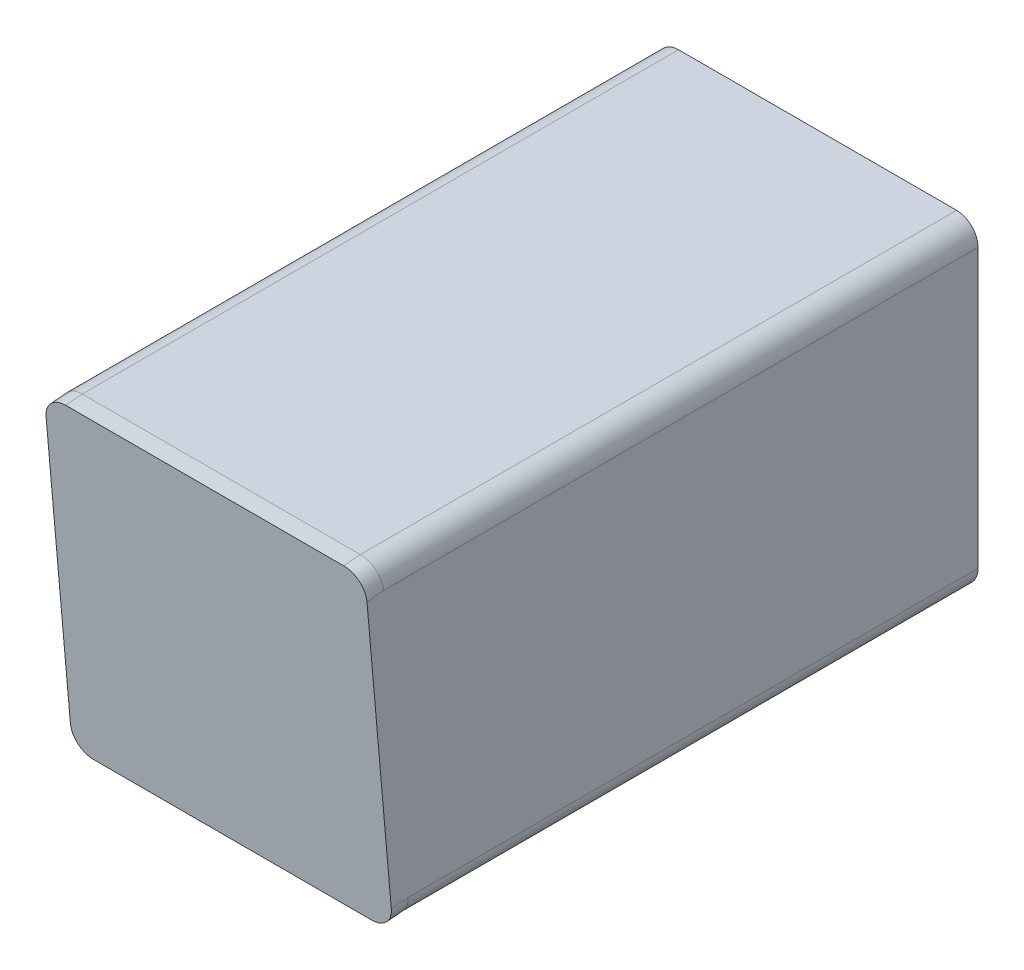
ISO-10303-21;
HEADER;
FILE_DESCRIPTION(('STEP AP214'),'2;1');
FILE_NAME('part.step','',(''),(''),'','','');
FILE_SCHEMA(('AUTOMOTIVE_DESIGN { 1 0 10303 214 1 1 1 1 }'));
ENDSEC;
DATA;
#1=APPLICATION_CONTEXT('core data for automotive mechanical design processes');
#2=APPLICATION_PROTOCOL_DEFINITION('international standard','automotive_design',2000,#1);
#3=PRODUCT_CONTEXT('',#1,'mechanical');
#4=PRODUCT('Part','Part','',(#3));
#5=PRODUCT_RELATED_PRODUCT_CATEGORY('part','',(#4));
#6=PRODUCT_DEFINITION_FORMATION('','',#4);
#7=PRODUCT_DEFINITION_CONTEXT('part definition',#1,'design');
#8=PRODUCT_DEFINITION('design','',#6,#7);
#9=PRODUCT_DEFINITION_SHAPE('','',#8);
#10=(LENGTH_UNIT() NAMED_UNIT(*) SI_UNIT(.MILLI.,.METRE.));
#11=(NAMED_UNIT(*) PLANE_ANGLE_UNIT() SI_UNIT($,.RADIAN.));
#12=(NAMED_UNIT(*) SI_UNIT($,.STERADIAN.) SOLID_ANGLE_UNIT());
#13=UNCERTAINTY_MEASURE_WITH_UNIT(LENGTH_MEASURE(1.E-05),#10,'distance_accuracy_value','');
#14=(GEOMETRIC_REPRESENTATION_CONTEXT(3) GLOBAL_UNCERTAINTY_ASSIGNED_CONTEXT((#13)) GLOBAL_UNIT_ASSIGNED_CONTEXT((#10,
#11,#12)) REPRESENTATION_CONTEXT('',''));
#15=CARTESIAN_POINT('',(0.,0.,0.));
#16=DIRECTION('',(0.,0.,1.));
#17=DIRECTION('',(1.,0.,0.));
#18=AXIS2_PLACEMENT_3D('',#15,#16,#17);
#19=CARTESIAN_POINT('',(2.54,-35.56,0.));
#20=DIRECTION('',(0.,0.,1.));
#21=DIRECTION('',(1.,0.,0.));
#22=AXIS2_PLACEMENT_3D('',#19,#20,#21);
#23=PLANE('',#22);
#24=CARTESIAN_POINT('',(2.54,-35.56,0.));
#25=DIRECTION('',(0.,0.,1.));
#26=DIRECTION('',(1.,0.,0.));
#27=AXIS2_PLACEMENT_3D('',#24,#25,#26);
#28=CIRCLE('',#27,2.54);
#29=CARTESIAN_POINT('',(0.,-35.56,0.));
#30=VERTEX_POINT('',#29);
#31=CARTESIAN_POINT('',(2.54000000000002,-38.1,0.));
#32=VERTEX_POINT('',#31);
#33=EDGE_CURVE('E363',#30,#32,#28,.T.);
#34=ORIENTED_EDGE('',*,*,#33,.F.);
#35=DIRECTION('',(0.,-1.,0.));
#36=VECTOR('',#35,1.);
#37=CARTESIAN_POINT('',(0.,-2.54000000000002,0.));
#38=LINE('',#37,#36);
#39=CARTESIAN_POINT('',(0.,-2.54000000000002,0.));
#40=VERTEX_POINT('',#39);
#41=EDGE_CURVE('E347',#40,#30,#38,.T.);
#42=ORIENTED_EDGE('',*,*,#41,.F.);
#43=CARTESIAN_POINT('',(2.54,-2.54,0.));
#44=DIRECTION('',(0.,0.,1.));
#45=DIRECTION('',(-1.,0.,0.));
#46=AXIS2_PLACEMENT_3D('',#43,#44,#45);
#47=CIRCLE('',#46,2.54);
#48=CARTESIAN_POINT('',(2.54000000000002,0.,0.));
#49=VERTEX_POINT('',#48);
#50=EDGE_CURVE('E350',#49,#40,#47,.T.);
#51=ORIENTED_EDGE('',*,*,#50,.F.);
#52=DIRECTION('',(-1.,0.,0.));
#53=VECTOR('',#52,1.);
#54=CARTESIAN_POINT('',(2.54000000000002,0.,0.));
#55=LINE('',#54,#53);
#56=CARTESIAN_POINT('',(35.56,0.,0.));
#57=VERTEX_POINT('',#56);
#58=EDGE_CURVE('E353',#57,#49,#55,.T.);
#59=ORIENTED_EDGE('',*,*,#58,.F.);
#60=CARTESIAN_POINT('',(35.56,-2.54,0.));
#61=DIRECTION('',(0.,0.,1.));
#62=DIRECTION('',(1.,0.,0.));
#63=AXIS2_PLACEMENT_3D('',#60,#61,#62);
#64=CIRCLE('',#63,2.54);
#65=CARTESIAN_POINT('',(38.1,-2.54000000000002,0.));
#66=VERTEX_POINT('',#65);
#67=EDGE_CURVE('E355',#66,#57,#64,.T.);
#68=ORIENTED_EDGE('',*,*,#67,.F.);
#69=DIRECTION('',(0.,1.,0.));
#70=VECTOR('',#69,1.);
#71=CARTESIAN_POINT('',(38.1,-2.54000000000002,0.));
#72=LINE('',#71,#70);
#73=CARTESIAN_POINT('',(38.1,-35.56,0.));
#74=VERTEX_POINT('',#73);
#75=EDGE_CURVE('E357',#74,#66,#72,.T.);
#76=ORIENTED_EDGE('',*,*,#75,.F.);
#77=CARTESIAN_POINT('',(35.56,-35.56,0.));
#78=DIRECTION('',(0.,0.,1.));
#79=DIRECTION('',(-1.,0.,0.));
#80=AXIS2_PLACEMENT_3D('',#77,#78,#79);
#81=CIRCLE('',#80,2.54);
#82=CARTESIAN_POINT('',(35.56,-38.1,0.));
#83=VERTEX_POINT('',#82);
#84=EDGE_CURVE('E360',#83,#74,#81,.T.);
#85=ORIENTED_EDGE('',*,*,#84,.F.);
#86=DIRECTION('',(1.,0.,0.));
#87=VECTOR('',#86,1.);
#88=CARTESIAN_POINT('',(2.54000000000002,-38.1,0.));
#89=LINE('',#88,#87);
#90=EDGE_CURVE('E326',#32,#83,#89,.T.);
#91=ORIENTED_EDGE('',*,*,#90,.F.);
#92=EDGE_LOOP('',(#34,#42,#51,#59,#68,#76,#85,#91));
#93=FACE_BOUND('',#92,.T.);
#94=CARTESIAN_POINT('',(5.3086,-32.7914,0.));
#95=DIRECTION('',(0.,0.,1.));
#96=DIRECTION('',(1.,0.,0.));
#97=AXIS2_PLACEMENT_3D('',#94,#95,#96);
#98=CIRCLE('',#97,2.54);
#99=CARTESIAN_POINT('',(2.7686,-32.7914,0.));
#100=VERTEX_POINT('',#99);
#101=CARTESIAN_POINT('',(5.30860000000002,-35.3314,0.));
#102=VERTEX_POINT('',#101);
#103=EDGE_CURVE('E405',#100,#102,#98,.T.);
#104=ORIENTED_EDGE('',*,*,#103,.T.);
#105=DIRECTION('',(1.,0.,0.));
#106=VECTOR('',#105,1.);
#107=CARTESIAN_POINT('',(5.30860000000002,-35.3314,0.));
#108=LINE('',#107,#106);
#109=CARTESIAN_POINT('',(32.7914,-35.3314,0.));
#110=VERTEX_POINT('',#109);
#111=EDGE_CURVE('E402',#102,#110,#108,.T.);
#112=ORIENTED_EDGE('',*,*,#111,.T.);
#113=CARTESIAN_POINT('',(32.7914,-32.7914,0.));
#114=DIRECTION('',(0.,0.,1.));
#115=DIRECTION('',(1.,0.,0.));
#116=AXIS2_PLACEMENT_3D('',#113,#114,#115);
#117=CIRCLE('',#116,2.54);
#118=CARTESIAN_POINT('',(35.3314,-32.7914,0.));
#119=VERTEX_POINT('',#118);
#120=EDGE_CURVE('E399',#110,#119,#117,.T.);
#121=ORIENTED_EDGE('',*,*,#120,.T.);
#122=DIRECTION('',(0.,1.,0.));
#123=VECTOR('',#122,1.);
#124=CARTESIAN_POINT('',(35.3314,-5.30860000000002,0.));
#125=LINE('',#124,#123);
#126=CARTESIAN_POINT('',(35.3314,-5.30860000000002,0.));
#127=VERTEX_POINT('',#126);
#128=EDGE_CURVE('E396',#119,#127,#125,.T.);
#129=ORIENTED_EDGE('',*,*,#128,.T.);
#130=CARTESIAN_POINT('',(32.7914,-5.3086,0.));
#131=DIRECTION('',(0.,0.,1.));
#132=DIRECTION('',(1.,0.,0.));
#133=AXIS2_PLACEMENT_3D('',#130,#131,#132);
#134=CIRCLE('',#133,2.54);
#135=CARTESIAN_POINT('',(32.7914,-2.7686,0.));
#136=VERTEX_POINT('',#135);
#137=EDGE_CURVE('E393',#127,#136,#134,.T.);
#138=ORIENTED_EDGE('',*,*,#137,.T.);
#139=DIRECTION('',(-1.,0.,0.));
#140=VECTOR('',#139,1.);
#141=CARTESIAN_POINT('',(5.30860000000002,-2.7686,0.));
#142=LINE('',#141,#140);
#143=CARTESIAN_POINT('',(5.30860000000002,-2.7686,0.));
#144=VERTEX_POINT('',#143);
#145=EDGE_CURVE('E390',#136,#144,#142,.T.);
#146=ORIENTED_EDGE('',*,*,#145,.T.);
#147=CARTESIAN_POINT('',(5.3086,-5.3086,0.));
#148=DIRECTION('',(0.,0.,1.));
#149=DIRECTION('',(1.,0.,0.));
#150=AXIS2_PLACEMENT_3D('',#147,#148,#149);
#151=CIRCLE('',#150,2.54);
#152=CARTESIAN_POINT('',(2.7686,-5.30860000000002,0.));
#153=VERTEX_POINT('',#152);
#154=EDGE_CURVE('E387',#144,#153,#151,.T.);
#155=ORIENTED_EDGE('',*,*,#154,.T.);
#156=DIRECTION('',(0.,-1.,0.));
#157=VECTOR('',#156,1.);
#158=CARTESIAN_POINT('',(2.7686,-5.30860000000002,0.));
#159=LINE('',#158,#157);
#160=EDGE_CURVE('E384',#153,#100,#159,.T.);
#161=ORIENTED_EDGE('',*,*,#160,.T.);
#162=EDGE_LOOP('',(#104,#112,#121,#129,#138,#146,#155,#161));
#163=FACE_BOUND('',#162,.T.);
#164=ADVANCED_FACE('F38',(#93,#163),#23,.F.);
#165=CARTESIAN_POINT('',(2.54,-35.56,70.8));
#166=DIRECTION('',(0.,0.,-1.));
#167=DIRECTION('',(-1.,0.,0.));
#168=AXIS2_PLACEMENT_3D('',#165,#166,#167);
#169=CYLINDRICAL_SURFACE('',#168,2.54);
#170=DIRECTION('',(0.,0.,-1.));
#171=VECTOR('',#170,1.);
#172=CARTESIAN_POINT('',(2.54000000000002,-38.1,70.8));
#173=LINE('',#172,#171);
#174=CARTESIAN_POINT('',(2.54000000000002,-38.1,67.4666819196626));
#175=VERTEX_POINT('',#174);
#176=EDGE_CURVE('E46',#175,#32,#173,.T.);
#177=ORIENTED_EDGE('',*,*,#176,.F.);
#178=CARTESIAN_POINT('',(2.54,-35.56,67.6889031250184));
#179=DIRECTION('',(0.,0.0871557427476515,-0.996194698091746));
#180=DIRECTION('',(0.,-0.996194698091746,-0.0871557427476515));
#181=AXIS2_PLACEMENT_3D('',#178,#179,#180);
#182=ELLIPSE('',#181,2.5497023873601,2.54);
#183=CARTESIAN_POINT('',(0.,-35.56,67.6889031250184));
#184=VERTEX_POINT('',#183);
#185=EDGE_CURVE('E408',#175,#184,#182,.T.);
#186=ORIENTED_EDGE('',*,*,#185,.T.);
#187=DIRECTION('',(0.,0.,-1.));
#188=VECTOR('',#187,1.);
#189=CARTESIAN_POINT('',(0.,-35.56,70.8));
#190=LINE('',#189,#188);
#191=EDGE_CURVE('E344',#184,#30,#190,.T.);
#192=ORIENTED_EDGE('',*,*,#191,.T.);
#193=ORIENTED_EDGE('',*,*,#33,.T.);
#194=EDGE_LOOP('',(#177,#186,#192,#193));
#195=FACE_BOUND('',#194,.T.);
#196=ADVANCED_FACE('F40',(#195),#169,.T.);
#197=CARTESIAN_POINT('',(2.54000000000002,-38.1,70.8));
#198=DIRECTION('',(0.,1.,0.));
#199=DIRECTION('',(0.,0.,1.));
#200=AXIS2_PLACEMENT_3D('',#197,#198,#199);
#201=PLANE('',#200);
#202=DIRECTION('',(0.,0.,-1.));
#203=VECTOR('',#202,1.);
#204=CARTESIAN_POINT('',(35.56,-38.1,70.8));
#205=LINE('',#204,#203);
#206=CARTESIAN_POINT('',(35.56,-38.1,67.4666819196626));
#207=VERTEX_POINT('',#206);
#208=EDGE_CURVE('E323',#207,#83,#205,.T.);
#209=ORIENTED_EDGE('',*,*,#208,.F.);
#210=DIRECTION('',(1.,0.,0.));
#211=VECTOR('',#210,1.);
#212=CARTESIAN_POINT('',(0.,-38.1,67.4666819196625));
#213=LINE('',#212,#211);
#214=EDGE_CURVE('E194',#175,#207,#213,.T.);
#215=ORIENTED_EDGE('',*,*,#214,.F.);
#216=ORIENTED_EDGE('',*,*,#176,.T.);
#217=ORIENTED_EDGE('',*,*,#90,.T.);
#218=EDGE_LOOP('',(#209,#215,#216,#217));
#219=FACE_BOUND('',#218,.T.);
#220=ADVANCED_FACE('F312',(#219),#201,.F.);
#221=CARTESIAN_POINT('',(35.56,-35.56,70.8));
#222=DIRECTION('',(0.,0.,-1.));
#223=DIRECTION('',(-1.,0.,0.));
#224=AXIS2_PLACEMENT_3D('',#221,#222,#223);
#225=CYLINDRICAL_SURFACE('',#224,2.54);
#226=DIRECTION('',(0.,0.,-1.));
#227=VECTOR('',#226,1.);
#228=CARTESIAN_POINT('',(38.1,-35.56,70.8));
#229=LINE('',#228,#227);
#230=CARTESIAN_POINT('',(38.1,-35.56,67.6889031250184));
#231=VERTEX_POINT('',#230);
#232=EDGE_CURVE('E330',#231,#74,#229,.T.);
#233=ORIENTED_EDGE('',*,*,#232,.F.);
#234=CARTESIAN_POINT('',(35.56,-35.56,67.6889031250184));
#235=DIRECTION('',(0.,0.0871557427476515,-0.996194698091746));
#236=DIRECTION('',(0.,-0.996194698091746,-0.0871557427476515));
#237=AXIS2_PLACEMENT_3D('',#234,#235,#236);
#238=ELLIPSE('',#237,2.5497023873601,2.54);
#239=EDGE_CURVE('E411',#231,#207,#238,.T.);
#240=ORIENTED_EDGE('',*,*,#239,.T.);
#241=ORIENTED_EDGE('',*,*,#208,.T.);
#242=ORIENTED_EDGE('',*,*,#84,.T.);
#243=EDGE_LOOP('',(#233,#240,#241,#242));
#244=FACE_BOUND('',#243,.T.);
#245=ADVANCED_FACE('F309',(#244),#225,.T.);
#246=CARTESIAN_POINT('',(38.1,-2.54000000000002,70.8));
#247=DIRECTION('',(-1.,0.,0.));
#248=DIRECTION('',(0.,-1.,0.));
#249=AXIS2_PLACEMENT_3D('',#246,#247,#248);
#250=PLANE('',#249);
#251=DIRECTION('',(0.,0.,-1.));
#252=VECTOR('',#251,1.);
#253=CARTESIAN_POINT('',(38.1,-2.54000000000002,70.8));
#254=LINE('',#253,#252);
#255=CARTESIAN_POINT('',(38.1,-2.54,70.5777787946442));
#256=VERTEX_POINT('',#255);
#257=EDGE_CURVE('E332',#256,#66,#254,.T.);
#258=ORIENTED_EDGE('',*,*,#257,.F.);
#259=DIRECTION('',(0.,0.0871557427476515,-0.996194698091746));
#260=VECTOR('',#259,1.);
#261=CARTESIAN_POINT('',(38.1,-7.41732271243648,126.325832495243));
#262=LINE('',#261,#260);
#263=CARTESIAN_POINT('',(38.1,-2.71225966825905,72.5467158125016));
#264=VERTEX_POINT('',#263);
#265=EDGE_CURVE('E219',#264,#256,#262,.T.);
#266=ORIENTED_EDGE('',*,*,#265,.F.);
#267=DIRECTION('',(0.,0.996194698091746,0.0871557427476584));
#268=VECTOR('',#267,1.);
#269=CARTESIAN_POINT('',(38.1,-35.7322596682594,69.6578401428843));
#270=LINE('',#269,#268);
#271=CARTESIAN_POINT('',(38.1,-35.7322596682598,69.6578401428843));
#272=VERTEX_POINT('',#271);
#273=EDGE_CURVE('E203',#272,#264,#270,.T.);
#274=ORIENTED_EDGE('',*,*,#273,.F.);
#275=DIRECTION('',(0.,0.0871557427476515,-0.996194698091746));
#276=VECTOR('',#275,1.);
#277=CARTESIAN_POINT('',(38.1,-40.4373227124365,123.436956825618));
#278=LINE('',#277,#276);
#279=EDGE_CURVE('E217',#272,#231,#278,.T.);
#280=ORIENTED_EDGE('',*,*,#279,.T.);
#281=ORIENTED_EDGE('',*,*,#232,.T.);
#282=ORIENTED_EDGE('',*,*,#75,.T.);
#283=EDGE_LOOP('',(#258,#266,#274,#280,#281,#282));
#284=FACE_BOUND('',#283,.T.);
#285=ADVANCED_FACE('F305',(#284),#250,.F.);
#286=CARTESIAN_POINT('',(35.56,-2.54,70.8));
#287=DIRECTION('',(0.,0.,-1.));
#288=DIRECTION('',(-1.,0.,0.));
#289=AXIS2_PLACEMENT_3D('',#286,#287,#288);
#290=CYLINDRICAL_SURFACE('',#289,2.54);
#291=DIRECTION('',(0.,0.,-1.));
#292=VECTOR('',#291,1.);
#293=CARTESIAN_POINT('',(35.56,0.,70.8));
#294=LINE('',#293,#292);
#295=CARTESIAN_POINT('',(35.56,0.,70.8));
#296=VERTEX_POINT('',#295);
#297=EDGE_CURVE('E336',#296,#57,#294,.T.);
#298=ORIENTED_EDGE('',*,*,#297,.F.);
#299=CARTESIAN_POINT('',(35.56,-2.54,70.5777787946442));
#300=DIRECTION('',(0.,0.0871557427476515,-0.996194698091746));
#301=DIRECTION('',(0.,-0.996194698091746,-0.0871557427476515));
#302=AXIS2_PLACEMENT_3D('',#299,#300,#301);
#303=ELLIPSE('',#302,2.5497023873601,2.54);
#304=EDGE_CURVE('E413',#296,#256,#303,.T.);
#305=ORIENTED_EDGE('',*,*,#304,.T.);
#306=ORIENTED_EDGE('',*,*,#257,.T.);
#307=ORIENTED_EDGE('',*,*,#67,.T.);
#308=EDGE_LOOP('',(#298,#305,#306,#307));
#309=FACE_BOUND('',#308,.T.);
#310=ADVANCED_FACE('F301',(#309),#290,.T.);
#311=CARTESIAN_POINT('',(2.54000000000002,0.,70.8));
#312=DIRECTION('',(0.,-1.,0.));
#313=DIRECTION('',(0.,0.,-1.));
#314=AXIS2_PLACEMENT_3D('',#311,#312,#313);
#315=PLANE('',#314);
#316=ORIENTED_EDGE('',*,*,#58,.T.);
#317=DIRECTION('',(0.,0.,-1.));
#318=VECTOR('',#317,1.);
#319=CARTESIAN_POINT('',(2.54000000000002,0.,70.8));
#320=LINE('',#319,#318);
#321=CARTESIAN_POINT('',(2.54,0.,70.8));
#322=VERTEX_POINT('',#321);
#323=EDGE_CURVE('E339',#322,#49,#320,.T.);
#324=ORIENTED_EDGE('',*,*,#323,.F.);
#325=DIRECTION('',(-1.,0.,0.));
#326=VECTOR('',#325,1.);
#327=CARTESIAN_POINT('',(2.54000000000002,0.,70.8));
#328=LINE('',#327,#326);
#329=EDGE_CURVE('E346',#296,#322,#328,.T.);
#330=ORIENTED_EDGE('',*,*,#329,.F.);
#331=ORIENTED_EDGE('',*,*,#297,.T.);
#332=EDGE_LOOP('',(#316,#324,#330,#331));
#333=FACE_BOUND('',#332,.T.);
#334=ADVANCED_FACE('F297',(#333),#315,.F.);
#335=CARTESIAN_POINT('',(2.54,-2.54,70.8));
#336=DIRECTION('',(0.,0.,-1.));
#337=DIRECTION('',(-1.,0.,0.));
#338=AXIS2_PLACEMENT_3D('',#335,#336,#337);
#339=CYLINDRICAL_SURFACE('',#338,2.54);
#340=DIRECTION('',(0.,0.,-1.));
#341=VECTOR('',#340,1.);
#342=CARTESIAN_POINT('',(0.,-2.54000000000002,70.8));
#343=LINE('',#342,#341);
#344=CARTESIAN_POINT('',(0.,-2.54000000000002,70.5777787946442));
#345=VERTEX_POINT('',#344);
#346=EDGE_CURVE('E342',#345,#40,#343,.T.);
#347=ORIENTED_EDGE('',*,*,#346,.F.);
#348=CARTESIAN_POINT('',(2.54,-2.54,70.5777787946442));
#349=DIRECTION('',(0.,0.0871557427476515,-0.996194698091746));
#350=DIRECTION('',(0.,-0.996194698091746,-0.0871557427476515));
#351=AXIS2_PLACEMENT_3D('',#348,#349,#350);
#352=ELLIPSE('',#351,2.5497023873601,2.54);
#353=EDGE_CURVE('E53',#345,#322,#352,.T.);
#354=ORIENTED_EDGE('',*,*,#353,.T.);
#355=ORIENTED_EDGE('',*,*,#323,.T.);
#356=ORIENTED_EDGE('',*,*,#50,.T.);
#357=EDGE_LOOP('',(#347,#354,#355,#356));
#358=FACE_BOUND('',#357,.T.);
#359=ADVANCED_FACE('F294',(#358),#339,.T.);
#360=CARTESIAN_POINT('',(0.,-2.54000000000002,70.8));
#361=DIRECTION('',(1.,0.,0.));
#362=DIRECTION('',(0.,1.,0.));
#363=AXIS2_PLACEMENT_3D('',#360,#361,#362);
#364=PLANE('',#363);
#365=ORIENTED_EDGE('',*,*,#191,.F.);
#366=DIRECTION('',(0.,0.0871557427476515,-0.996194698091746));
#367=VECTOR('',#366,1.);
#368=CARTESIAN_POINT('',(0.,-40.4373227124365,123.436956825618));
#369=LINE('',#368,#367);
#370=CARTESIAN_POINT('',(0.,-35.7322596682598,69.6578401428843));
#371=VERTEX_POINT('',#370);
#372=EDGE_CURVE('E184',#371,#184,#369,.T.);
#373=ORIENTED_EDGE('',*,*,#372,.F.);
#374=DIRECTION('',(0.,-0.996194698091746,-0.0871557427476584));
#375=VECTOR('',#374,1.);
#376=CARTESIAN_POINT('',(0.,-2.71225966825946,72.5467158125103));
#377=LINE('',#376,#375);
#378=CARTESIAN_POINT('',(0.,-2.71225966825983,72.5467158125103));
#379=VERTEX_POINT('',#378);
#380=EDGE_CURVE('E178',#379,#371,#377,.T.);
#381=ORIENTED_EDGE('',*,*,#380,.F.);
#382=DIRECTION('',(0.,0.0871557427476515,-0.996194698091746));
#383=VECTOR('',#382,1.);
#384=CARTESIAN_POINT('',(0.,-7.4173227124365,126.325832495243));
#385=LINE('',#384,#383);
#386=EDGE_CURVE('E170',#379,#345,#385,.T.);
#387=ORIENTED_EDGE('',*,*,#386,.T.);
#388=ORIENTED_EDGE('',*,*,#346,.T.);
#389=ORIENTED_EDGE('',*,*,#41,.T.);
#390=EDGE_LOOP('',(#365,#373,#381,#387,#388,#389));
#391=FACE_BOUND('',#390,.T.);
#392=ADVANCED_FACE('F183',(#391),#364,.F.);
#393=CARTESIAN_POINT('',(5.3086,-32.7914,70.8));
#394=DIRECTION('',(0.,0.,-1.));
#395=DIRECTION('',(-1.,0.,0.));
#396=AXIS2_PLACEMENT_3D('',#393,#394,#395);
#397=CYLINDRICAL_SURFACE('',#396,2.54);
#398=CARTESIAN_POINT('',(5.3086,-32.7914,67.9311242388562));
#399=DIRECTION('',(0.,0.0871557427476515,-0.996194698091746));
#400=DIRECTION('',(0.,-0.996194698091746,-0.0871557427476515));
#401=AXIS2_PLACEMENT_3D('',#398,#399,#400);
#402=ELLIPSE('',#401,2.5497023873601,2.54);
#403=CARTESIAN_POINT('',(5.30860000000002,-35.3314,67.7089030335004));
#404=VERTEX_POINT('',#403);
#405=CARTESIAN_POINT('',(2.7686,-32.7914,67.9311242388562));
#406=VERTEX_POINT('',#405);
#407=EDGE_CURVE('E417',#404,#406,#402,.T.);
#408=ORIENTED_EDGE('',*,*,#407,.F.);
#409=DIRECTION('',(0.,0.,-1.));
#410=VECTOR('',#409,1.);
#411=CARTESIAN_POINT('',(5.30860000000002,-35.3314,70.8));
#412=LINE('',#411,#410);
#413=EDGE_CURVE('E366',#404,#102,#412,.T.);
#414=ORIENTED_EDGE('',*,*,#413,.T.);
#415=ORIENTED_EDGE('',*,*,#103,.F.);
#416=DIRECTION('',(0.,0.,-1.));
#417=VECTOR('',#416,1.);
#418=CARTESIAN_POINT('',(2.7686,-32.7914,70.8));
#419=LINE('',#418,#417);
#420=EDGE_CURVE('E382',#406,#100,#419,.T.);
#421=ORIENTED_EDGE('',*,*,#420,.F.);
#422=EDGE_LOOP('',(#408,#414,#415,#421));
#423=FACE_BOUND('',#422,.T.);
#424=ADVANCED_FACE('F284',(#423),#397,.F.);
#425=CARTESIAN_POINT('',(5.30860000000002,-35.3314,70.8));
#426=DIRECTION('',(0.,1.,0.));
#427=DIRECTION('',(0.,0.,1.));
#428=AXIS2_PLACEMENT_3D('',#425,#426,#427);
#429=PLANE('',#428);
#430=DIRECTION('',(-1.,0.,0.));
#431=VECTOR('',#430,1.);
#432=CARTESIAN_POINT('',(5.30860000000002,-35.3314,67.7089030335004));
#433=LINE('',#432,#431);
#434=CARTESIAN_POINT('',(32.7914,-35.3314,67.7089030335004));
#435=VERTEX_POINT('',#434);
#436=EDGE_CURVE('E420',#435,#404,#433,.T.);
#437=ORIENTED_EDGE('',*,*,#436,.F.);
#438=DIRECTION('',(0.,0.,-1.));
#439=VECTOR('',#438,1.);
#440=CARTESIAN_POINT('',(32.7914,-35.3314,70.8));
#441=LINE('',#440,#439);
#442=EDGE_CURVE('E370',#435,#110,#441,.T.);
#443=ORIENTED_EDGE('',*,*,#442,.T.);
#444=ORIENTED_EDGE('',*,*,#111,.F.);
#445=ORIENTED_EDGE('',*,*,#413,.F.);
#446=EDGE_LOOP('',(#437,#443,#444,#445));
#447=FACE_BOUND('',#446,.T.);
#448=ADVANCED_FACE('F280',(#447),#429,.T.);
#449=CARTESIAN_POINT('',(32.7914,-32.7914,70.8));
#450=DIRECTION('',(0.,0.,-1.));
#451=DIRECTION('',(-1.,0.,0.));
#452=AXIS2_PLACEMENT_3D('',#449,#450,#451);
#453=CYLINDRICAL_SURFACE('',#452,2.54);
#454=CARTESIAN_POINT('',(32.7914,-32.7914,67.9311242388562));
#455=DIRECTION('',(0.,0.0871557427476515,-0.996194698091746));
#456=DIRECTION('',(0.,-0.996194698091746,-0.0871557427476515));
#457=AXIS2_PLACEMENT_3D('',#454,#455,#456);
#458=ELLIPSE('',#457,2.5497023873601,2.54);
#459=CARTESIAN_POINT('',(35.3314,-32.7914,67.9311242388562));
#460=VERTEX_POINT('',#459);
#461=EDGE_CURVE('E423',#460,#435,#458,.T.);
#462=ORIENTED_EDGE('',*,*,#461,.F.);
#463=DIRECTION('',(0.,0.,-1.));
#464=VECTOR('',#463,1.);
#465=CARTESIAN_POINT('',(35.3314,-32.7914,70.8));
#466=LINE('',#465,#464);
#467=EDGE_CURVE('E372',#460,#119,#466,.T.);
#468=ORIENTED_EDGE('',*,*,#467,.T.);
#469=ORIENTED_EDGE('',*,*,#120,.F.);
#470=ORIENTED_EDGE('',*,*,#442,.F.);
#471=EDGE_LOOP('',(#462,#468,#469,#470));
#472=FACE_BOUND('',#471,.T.);
#473=ADVANCED_FACE('F276',(#472),#453,.F.);
#474=CARTESIAN_POINT('',(35.3314,-5.30860000000002,70.8));
#475=DIRECTION('',(-1.,0.,0.));
#476=DIRECTION('',(0.,0.,1.));
#477=AXIS2_PLACEMENT_3D('',#474,#475,#476);
#478=PLANE('',#477);
#479=DIRECTION('',(0.,-0.996194698091746,-0.0871557427476515));
#480=VECTOR('',#479,1.);
#481=CARTESIAN_POINT('',(35.3314,-5.26827521882033,70.3390856420187));
#482=LINE('',#481,#480);
#483=CARTESIAN_POINT('',(35.3314,-5.30860000000002,70.3355576808063));
#484=VERTEX_POINT('',#483);
#485=EDGE_CURVE('E426',#484,#460,#482,.T.);
#486=ORIENTED_EDGE('',*,*,#485,.F.);
#487=DIRECTION('',(0.,0.,-1.));
#488=VECTOR('',#487,1.);
#489=CARTESIAN_POINT('',(35.3314,-5.30860000000002,70.8));
#490=LINE('',#489,#488);
#491=EDGE_CURVE('E374',#484,#127,#490,.T.);
#492=ORIENTED_EDGE('',*,*,#491,.T.);
#493=ORIENTED_EDGE('',*,*,#128,.F.);
#494=ORIENTED_EDGE('',*,*,#467,.F.);
#495=EDGE_LOOP('',(#486,#492,#493,#494));
#496=FACE_BOUND('',#495,.T.);
#497=ADVANCED_FACE('F272',(#496),#478,.T.);
#498=CARTESIAN_POINT('',(32.7914,-5.3086,70.8));
#499=DIRECTION('',(0.,0.,-1.));
#500=DIRECTION('',(-1.,0.,0.));
#501=AXIS2_PLACEMENT_3D('',#498,#499,#500);
#502=CYLINDRICAL_SURFACE('',#501,2.54);
#503=CARTESIAN_POINT('',(32.7914,-5.3086,70.3355576808063));
#504=DIRECTION('',(0.,0.0871557427476515,-0.996194698091746));
#505=DIRECTION('',(0.,-0.996194698091746,-0.0871557427476515));
#506=AXIS2_PLACEMENT_3D('',#503,#504,#505);
#507=ELLIPSE('',#506,2.5497023873601,2.54);
#508=CARTESIAN_POINT('',(32.7914,-2.7686,70.5577788861621));
#509=VERTEX_POINT('',#508);
#510=EDGE_CURVE('E429',#509,#484,#507,.T.);
#511=ORIENTED_EDGE('',*,*,#510,.F.);
#512=DIRECTION('',(0.,0.,-1.));
#513=VECTOR('',#512,1.);
#514=CARTESIAN_POINT('',(32.7914,-2.7686,70.8));
#515=LINE('',#514,#513);
#516=EDGE_CURVE('E376',#509,#136,#515,.T.);
#517=ORIENTED_EDGE('',*,*,#516,.T.);
#518=ORIENTED_EDGE('',*,*,#137,.F.);
#519=ORIENTED_EDGE('',*,*,#491,.F.);
#520=EDGE_LOOP('',(#511,#517,#518,#519));
#521=FACE_BOUND('',#520,.T.);
#522=ADVANCED_FACE('F268',(#521),#502,.F.);
#523=CARTESIAN_POINT('',(5.30860000000002,-2.7686,70.8));
#524=DIRECTION('',(0.,-1.,0.));
#525=DIRECTION('',(0.,0.,-1.));
#526=AXIS2_PLACEMENT_3D('',#523,#524,#525);
#527=PLANE('',#526);
#528=DIRECTION('',(1.,0.,0.));
#529=VECTOR('',#528,1.);
#530=CARTESIAN_POINT('',(5.30860000000002,-2.7686,70.5577788861621));
#531=LINE('',#530,#529);
#532=CARTESIAN_POINT('',(5.30860000000002,-2.7686,70.5577788861621));
#533=VERTEX_POINT('',#532);
#534=EDGE_CURVE('E432',#533,#509,#531,.T.);
#535=ORIENTED_EDGE('',*,*,#534,.F.);
#536=DIRECTION('',(0.,0.,-1.));
#537=VECTOR('',#536,1.);
#538=CARTESIAN_POINT('',(5.30860000000002,-2.7686,70.8));
#539=LINE('',#538,#537);
#540=EDGE_CURVE('E378',#533,#144,#539,.T.);
#541=ORIENTED_EDGE('',*,*,#540,.T.);
#542=ORIENTED_EDGE('',*,*,#145,.F.);
#543=ORIENTED_EDGE('',*,*,#516,.F.);
#544=EDGE_LOOP('',(#535,#541,#542,#543));
#545=FACE_BOUND('',#544,.T.);
#546=ADVANCED_FACE('F264',(#545),#527,.T.);
#547=CARTESIAN_POINT('',(5.3086,-5.3086,70.8));
#548=DIRECTION('',(0.,0.,-1.));
#549=DIRECTION('',(-1.,0.,0.));
#550=AXIS2_PLACEMENT_3D('',#547,#548,#549);
#551=CYLINDRICAL_SURFACE('',#550,2.54);
#552=CARTESIAN_POINT('',(5.3086,-5.3086,70.3355576808063));
#553=DIRECTION('',(0.,0.0871557427476515,-0.996194698091746));
#554=DIRECTION('',(0.,-0.996194698091746,-0.0871557427476515));
#555=AXIS2_PLACEMENT_3D('',#552,#553,#554);
#556=ELLIPSE('',#555,2.5497023873601,2.54);
#557=CARTESIAN_POINT('',(2.7686,-5.30860000000002,70.3355576808063));
#558=VERTEX_POINT('',#557);
#559=EDGE_CURVE('E197',#558,#533,#556,.T.);
#560=ORIENTED_EDGE('',*,*,#559,.F.);
#561=DIRECTION('',(0.,0.,-1.));
#562=VECTOR('',#561,1.);
#563=CARTESIAN_POINT('',(2.7686,-5.30860000000002,70.8));
#564=LINE('',#563,#562);
#565=EDGE_CURVE('E380',#558,#153,#564,.T.);
#566=ORIENTED_EDGE('',*,*,#565,.T.);
#567=ORIENTED_EDGE('',*,*,#154,.F.);
#568=ORIENTED_EDGE('',*,*,#540,.F.);
#569=EDGE_LOOP('',(#560,#566,#567,#568));
#570=FACE_BOUND('',#569,.T.);
#571=ADVANCED_FACE('F261',(#570),#551,.F.);
#572=CARTESIAN_POINT('',(2.7686,-5.30860000000002,70.8));
#573=DIRECTION('',(1.,0.,0.));
#574=DIRECTION('',(0.,0.,-1.));
#575=AXIS2_PLACEMENT_3D('',#572,#573,#574);
#576=PLANE('',#575);
#577=DIRECTION('',(0.,0.996194698091746,0.0871557427476515));
#578=VECTOR('',#577,1.);
#579=CARTESIAN_POINT('',(2.7686,-5.26827521882033,70.3390856420187));
#580=LINE('',#579,#578);
#581=EDGE_CURVE('E11',#406,#558,#580,.T.);
#582=ORIENTED_EDGE('',*,*,#581,.F.);
#583=ORIENTED_EDGE('',*,*,#420,.T.);
#584=ORIENTED_EDGE('',*,*,#160,.F.);
#585=ORIENTED_EDGE('',*,*,#565,.F.);
#586=EDGE_LOOP('',(#582,#583,#584,#585));
#587=FACE_BOUND('',#586,.T.);
#588=ADVANCED_FACE('F258',(#587),#576,.T.);
#589=CARTESIAN_POINT('',(2.54000000000001,-1265.75285666006,-37.9550179972877));
#590=DIRECTION('',(0.,-0.0871557427476584,0.996194698091746));
#591=DIRECTION('',(0.,-0.996194698091746,-0.0871557427476584));
#592=AXIS2_PLACEMENT_3D('',#589,#590,#591);
#593=PLANE('',#592);
#594=ORIENTED_EDGE('',*,*,#380,.T.);
#595=CARTESIAN_POINT('',(2.54,-35.732259668259,69.6578401428758));
#596=DIRECTION('',(0.,-0.0871557427476515,0.996194698091746));
#597=DIRECTION('',(0.,-0.996194698091746,-0.0871557427476515));
#598=AXIS2_PLACEMENT_3D('',#595,#596,#597);
#599=ELLIPSE('',#598,2.5497023873601,2.54);
#600=CARTESIAN_POINT('',(2.54000000000002,-38.2722596682598,69.4356189375284));
#601=VERTEX_POINT('',#600);
#602=EDGE_CURVE('E188',#371,#601,#599,.T.);
#603=ORIENTED_EDGE('',*,*,#602,.T.);
#604=DIRECTION('',(1.,0.,0.));
#605=VECTOR('',#604,1.);
#606=CARTESIAN_POINT('',(2.54000000000001,-38.2722596682598,69.4356189375284));
#607=LINE('',#606,#605);
#608=CARTESIAN_POINT('',(35.56,-38.2722596682591,69.43561893752));
#609=VERTEX_POINT('',#608);
#610=EDGE_CURVE('E209',#601,#609,#607,.T.);
#611=ORIENTED_EDGE('',*,*,#610,.T.);
#612=CARTESIAN_POINT('',(35.56,-35.732259668259,69.6578401428758));
#613=DIRECTION('',(0.,-0.0871557427476515,0.996194698091746));
#614=DIRECTION('',(0.,-0.996194698091746,-0.0871557427476515));
#615=AXIS2_PLACEMENT_3D('',#612,#613,#614);
#616=ELLIPSE('',#615,2.5497023873601,2.54);
#617=EDGE_CURVE('E206',#609,#272,#616,.T.);
#618=ORIENTED_EDGE('',*,*,#617,.T.);
#619=ORIENTED_EDGE('',*,*,#273,.T.);
#620=CARTESIAN_POINT('',(35.56,-2.71225966825905,72.5467158125016));
#621=DIRECTION('',(0.,-0.0871557427476515,0.996194698091746));
#622=DIRECTION('',(0.,-0.996194698091746,-0.0871557427476515));
#623=AXIS2_PLACEMENT_3D('',#620,#621,#622);
#624=ELLIPSE('',#623,2.5497023873601,2.54);
#625=CARTESIAN_POINT('',(35.56,-0.172259668259815,72.7689370178662));
#626=VERTEX_POINT('',#625);
#627=EDGE_CURVE('E199',#264,#626,#624,.T.);
#628=ORIENTED_EDGE('',*,*,#627,.T.);
#629=DIRECTION('',(-1.,0.,0.));
#630=VECTOR('',#629,1.);
#631=CARTESIAN_POINT('',(35.56,-0.172259668259812,72.7689370178662));
#632=LINE('',#631,#630);
#633=CARTESIAN_POINT('',(2.54,-0.172259668259049,72.7689370178574));
#634=VERTEX_POINT('',#633);
#635=EDGE_CURVE('E193',#626,#634,#632,.T.);
#636=ORIENTED_EDGE('',*,*,#635,.T.);
#637=CARTESIAN_POINT('',(2.54,-2.71225966825905,72.5467158125016));
#638=DIRECTION('',(0.,-0.0871557427476515,0.996194698091746));
#639=DIRECTION('',(0.,-0.996194698091746,-0.0871557427476515));
#640=AXIS2_PLACEMENT_3D('',#637,#638,#639);
#641=ELLIPSE('',#640,2.5497023873601,2.54);
#642=EDGE_CURVE('E174',#634,#379,#641,.T.);
#643=ORIENTED_EDGE('',*,*,#642,.T.);
#644=EDGE_LOOP('',(#594,#603,#611,#618,#619,#628,#636,#643));
#645=FACE_BOUND('',#644,.T.);
#646=ADVANCED_FACE('F191',(#645),#593,.T.);
#647=CARTESIAN_POINT('',(2.54,-7.41732271243648,126.325832495243));
#648=DIRECTION('',(0.,-0.0871557427476515,0.996194698091746));
#649=DIRECTION('',(0.,-0.996194698091746,-0.0871557427476515));
#650=AXIS2_PLACEMENT_3D('',#647,#648,#649);
#651=ELLIPSE('',#650,2.5497023873601,2.54);
#652=DIRECTION('',(0.,0.0871557427476515,-0.996194698091746));
#653=VECTOR('',#652,1.);
#654=SURFACE_OF_LINEAR_EXTRUSION('',#651,#653);
#655=ORIENTED_EDGE('',*,*,#642,.F.);
#656=DIRECTION('',(0.,0.0871557427476515,-0.996194698091746));
#657=VECTOR('',#656,1.);
#658=CARTESIAN_POINT('',(2.54,-4.87732271243648,126.548053700599));
#659=LINE('',#658,#657);
#660=EDGE_CURVE('E179',#634,#322,#659,.T.);
#661=ORIENTED_EDGE('',*,*,#660,.T.);
#662=ORIENTED_EDGE('',*,*,#353,.F.);
#663=ORIENTED_EDGE('',*,*,#386,.F.);
#664=EDGE_LOOP('',(#655,#661,#662,#663));
#665=FACE_BOUND('',#664,.T.);
#666=ADVANCED_FACE('F172',(#665),#654,.F.);
#667=CARTESIAN_POINT('',(35.56,-4.87732271243648,126.548053700599));
#668=DIRECTION('',(0.,-0.996194698091746,-0.0871557427476515));
#669=DIRECTION('',(0.,0.0871557427476515,-0.996194698091746));
#670=AXIS2_PLACEMENT_3D('',#667,#668,#669);
#671=PLANE('',#670);
#672=ORIENTED_EDGE('',*,*,#635,.F.);
#673=DIRECTION('',(0.,0.0871557427476515,-0.996194698091746));
#674=VECTOR('',#673,1.);
#675=CARTESIAN_POINT('',(35.56,-4.87732271243648,126.548053700599));
#676=LINE('',#675,#674);
#677=EDGE_CURVE('E221',#626,#296,#676,.T.);
#678=ORIENTED_EDGE('',*,*,#677,.T.);
#679=ORIENTED_EDGE('',*,*,#329,.T.);
#680=ORIENTED_EDGE('',*,*,#660,.F.);
#681=EDGE_LOOP('',(#672,#678,#679,#680));
#682=FACE_BOUND('',#681,.T.);
#683=ADVANCED_FACE('F233',(#682),#671,.F.);
#684=CARTESIAN_POINT('',(35.56,-7.41732271243649,126.325832495243));
#685=DIRECTION('',(0.,-0.0871557427476515,0.996194698091746));
#686=DIRECTION('',(0.,-0.996194698091746,-0.0871557427476515));
#687=AXIS2_PLACEMENT_3D('',#684,#685,#686);
#688=ELLIPSE('',#687,2.5497023873601,2.54);
#689=DIRECTION('',(0.,0.0871557427476515,-0.996194698091746));
#690=VECTOR('',#689,1.);
#691=SURFACE_OF_LINEAR_EXTRUSION('',#688,#690);
#692=ORIENTED_EDGE('',*,*,#627,.F.);
#693=ORIENTED_EDGE('',*,*,#265,.T.);
#694=ORIENTED_EDGE('',*,*,#304,.F.);
#695=ORIENTED_EDGE('',*,*,#677,.F.);
#696=EDGE_LOOP('',(#692,#693,#694,#695));
#697=FACE_BOUND('',#696,.T.);
#698=ADVANCED_FACE('F237',(#697),#691,.F.);
#699=CARTESIAN_POINT('',(35.56,-40.4373227124365,123.436956825618));
#700=DIRECTION('',(0.,-0.0871557427476515,0.996194698091746));
#701=DIRECTION('',(0.,-0.996194698091746,-0.0871557427476515));
#702=AXIS2_PLACEMENT_3D('',#699,#700,#701);
#703=ELLIPSE('',#702,2.5497023873601,2.54);
#704=DIRECTION('',(0.,0.0871557427476515,-0.996194698091746));
#705=VECTOR('',#704,1.);
#706=SURFACE_OF_LINEAR_EXTRUSION('',#703,#705);
#707=ORIENTED_EDGE('',*,*,#617,.F.);
#708=DIRECTION('',(0.,0.0871557427476515,-0.996194698091746));
#709=VECTOR('',#708,1.);
#710=CARTESIAN_POINT('',(35.56,-42.9773227124365,123.214735620262));
#711=LINE('',#710,#709);
#712=EDGE_CURVE('E215',#609,#207,#711,.T.);
#713=ORIENTED_EDGE('',*,*,#712,.T.);
#714=ORIENTED_EDGE('',*,*,#239,.F.);
#715=ORIENTED_EDGE('',*,*,#279,.F.);
#716=EDGE_LOOP('',(#707,#713,#714,#715));
#717=FACE_BOUND('',#716,.T.);
#718=ADVANCED_FACE('F241',(#717),#706,.F.);
#719=CARTESIAN_POINT('',(2.54000000000002,-42.9773227124365,123.214735620262));
#720=DIRECTION('',(0.,0.996194698091746,0.0871557427476515));
#721=DIRECTION('',(0.,-0.0871557427476515,0.996194698091746));
#722=AXIS2_PLACEMENT_3D('',#719,#720,#721);
#723=PLANE('',#722);
#724=ORIENTED_EDGE('',*,*,#610,.F.);
#725=DIRECTION('',(0.,0.0871557427476515,-0.996194698091746));
#726=VECTOR('',#725,1.);
#727=CARTESIAN_POINT('',(2.54000000000002,-42.9773227124365,123.214735620262));
#728=LINE('',#727,#726);
#729=EDGE_CURVE('E213',#601,#175,#728,.T.);
#730=ORIENTED_EDGE('',*,*,#729,.T.);
#731=ORIENTED_EDGE('',*,*,#214,.T.);
#732=ORIENTED_EDGE('',*,*,#712,.F.);
#733=EDGE_LOOP('',(#724,#730,#731,#732));
#734=FACE_BOUND('',#733,.T.);
#735=ADVANCED_FACE('F245',(#734),#723,.F.);
#736=CARTESIAN_POINT('',(2.54000000000001,-40.4373227124365,123.436956825618));
#737=DIRECTION('',(0.,-0.0871557427476515,0.996194698091746));
#738=DIRECTION('',(0.,-0.996194698091746,-0.0871557427476515));
#739=AXIS2_PLACEMENT_3D('',#736,#737,#738);
#740=ELLIPSE('',#739,2.5497023873601,2.54);
#741=DIRECTION('',(0.,0.0871557427476515,-0.996194698091746));
#742=VECTOR('',#741,1.);
#743=SURFACE_OF_LINEAR_EXTRUSION('',#740,#742);
#744=ORIENTED_EDGE('',*,*,#602,.F.);
#745=ORIENTED_EDGE('',*,*,#372,.T.);
#746=ORIENTED_EDGE('',*,*,#185,.F.);
#747=ORIENTED_EDGE('',*,*,#729,.F.);
#748=EDGE_LOOP('',(#744,#745,#746,#747));
#749=FACE_BOUND('',#748,.T.);
#750=ADVANCED_FACE('F252',(#749),#743,.F.);
#751=CARTESIAN_POINT('',(2.54,-35.56,67.6889031250184));
#752=DIRECTION('',(0.,-0.0871557427476515,0.996194698091746));
#753=DIRECTION('',(0.,-0.996194698091746,-0.0871557427476515));
#754=AXIS2_PLACEMENT_3D('',#751,#752,#753);
#755=PLANE('',#754);
#756=ORIENTED_EDGE('',*,*,#407,.T.);
#757=ORIENTED_EDGE('',*,*,#581,.T.);
#758=ORIENTED_EDGE('',*,*,#559,.T.);
#759=ORIENTED_EDGE('',*,*,#534,.T.);
#760=ORIENTED_EDGE('',*,*,#510,.T.);
#761=ORIENTED_EDGE('',*,*,#485,.T.);
#762=ORIENTED_EDGE('',*,*,#461,.T.);
#763=ORIENTED_EDGE('',*,*,#436,.T.);
#764=EDGE_LOOP('',(#756,#757,#758,#759,#760,#761,#762,#763));
#765=FACE_BOUND('',#764,.T.);
#766=ADVANCED_FACE('F234',(#765),#755,.F.);
#767=CLOSED_SHELL('',(#164,#196,#220,#245,#285,#310,#334,#359,#392,#424,#448,#473,#497,#522,
#546,#571,#588,#646,#666,#683,#698,#718,#735,#750,#766));
#768=MANIFOLD_SOLID_BREP('B2',#767);
#769=ADVANCED_BREP_SHAPE_REPRESENTATION('',(#18,#768),#14);
#770=SHAPE_DEFINITION_REPRESENTATION(#9,#769);
ENDSEC;
END-ISO-10303-21;
